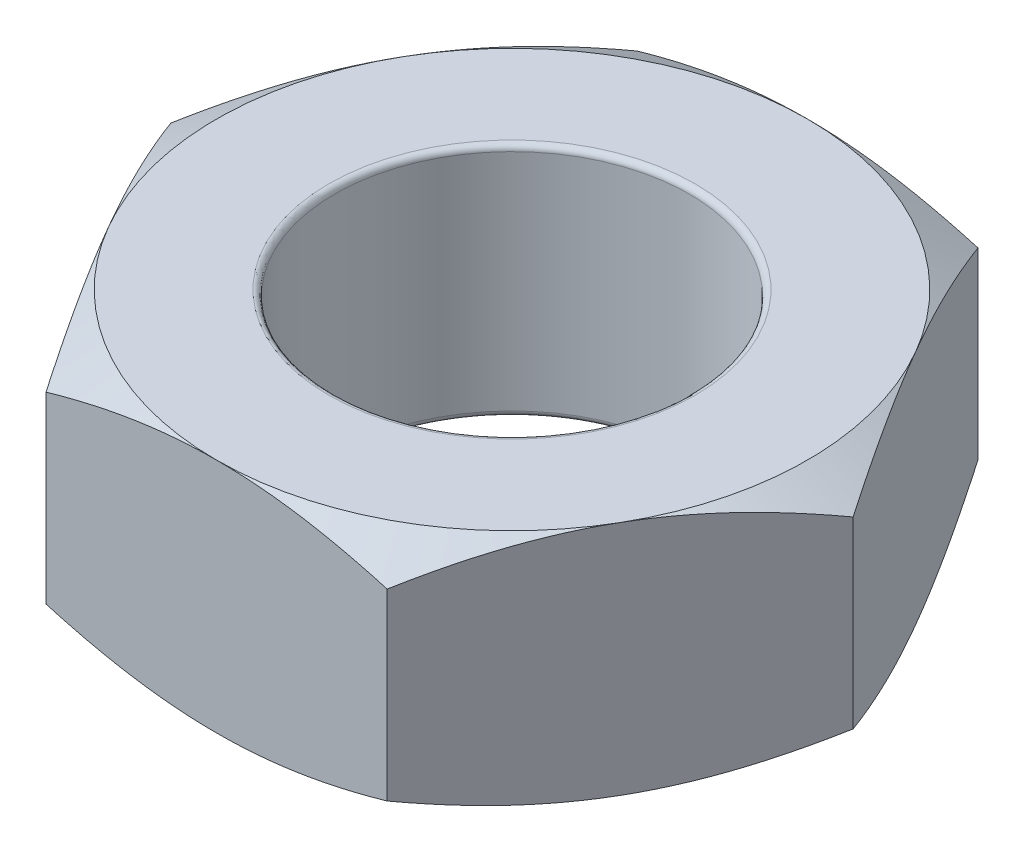
ISO-10303-21;
HEADER;
FILE_DESCRIPTION(('STEP AP214'),'2;1');
FILE_NAME('part.step','',(''),(''),'','','');
FILE_SCHEMA(('AUTOMOTIVE_DESIGN { 1 0 10303 214 1 1 1 1 }'));
ENDSEC;
DATA;
#1=APPLICATION_CONTEXT('core data for automotive mechanical design processes');
#2=APPLICATION_PROTOCOL_DEFINITION('international standard','automotive_design',2000,#1);
#3=PRODUCT_CONTEXT('',#1,'mechanical');
#4=PRODUCT('Part','Part','',(#3));
#5=PRODUCT_RELATED_PRODUCT_CATEGORY('part','',(#4));
#6=PRODUCT_DEFINITION_FORMATION('','',#4);
#7=PRODUCT_DEFINITION_CONTEXT('part definition',#1,'design');
#8=PRODUCT_DEFINITION('design','',#6,#7);
#9=PRODUCT_DEFINITION_SHAPE('','',#8);
#10=(LENGTH_UNIT() NAMED_UNIT(*) SI_UNIT(.MILLI.,.METRE.));
#11=(NAMED_UNIT(*) PLANE_ANGLE_UNIT() SI_UNIT($,.RADIAN.));
#12=(NAMED_UNIT(*) SI_UNIT($,.STERADIAN.) SOLID_ANGLE_UNIT());
#13=UNCERTAINTY_MEASURE_WITH_UNIT(LENGTH_MEASURE(1.E-05),#10,'distance_accuracy_value','');
#14=(GEOMETRIC_REPRESENTATION_CONTEXT(3) GLOBAL_UNCERTAINTY_ASSIGNED_CONTEXT((#13)) GLOBAL_UNIT_ASSIGNED_CONTEXT((#10,
#11,#12)) REPRESENTATION_CONTEXT('',''));
#15=CARTESIAN_POINT('',(0.,0.,0.));
#16=DIRECTION('',(0.,0.,1.));
#17=DIRECTION('',(1.,0.,0.));
#18=AXIS2_PLACEMENT_3D('',#15,#16,#17);
#19=CARTESIAN_POINT('',(-0.721687836487032,1.,-1.25));
#20=DIRECTION('',(0.866025403784439,0.,0.5));
#21=DIRECTION('',(0.5,0.,-0.866025403784439));
#22=AXIS2_PLACEMENT_3D('',#19,#20,#21);
#23=PLANE('',#22);
#24=CARTESIAN_POINT('',(-1.4434911430279,0.111712171512327,0.000200000000000438));
#25=CARTESIAN_POINT('',(-1.41177538446487,0.0933914116099904,-0.0547333052317648));
#26=CARTESIAN_POINT('',(-1.37978586023939,0.0767288030469375,-0.110140786500239));
#27=CARTESIAN_POINT('',(-1.31525277575269,0.0476428007920702,-0.221915367600339));
#28=CARTESIAN_POINT('',(-1.28270806805991,0.0352296988223504,-0.27828445484171));
#29=CARTESIAN_POINT('',(-1.21802202146378,0.0159051844823125,-0.390323974086984));
#30=CARTESIAN_POINT('',(-1.1858906404852,0.00886518629373267,-0.445977158459229));
#31=CARTESIAN_POINT('',(-1.12147653960455,0.0004579294769339,-0.557545653908391));
#32=CARTESIAN_POINT('',(-1.08919405413422,-0.000916287948974928,-0.6134605589376));
#33=CARTESIAN_POINT('',(-1.02886247391297,0.00192883421422075,-0.717957921181724));
#34=CARTESIAN_POINT('',(-1.00080438896118,0.00544959566631647,-0.766555949881315));
#35=CARTESIAN_POINT('',(-0.944871034195504,0.0166126095455567,-0.863435362173238));
#36=CARTESIAN_POINT('',(-0.91699595812502,0.0242586824189778,-0.911716410192163));
#37=CARTESIAN_POINT('',(-0.860947097873547,0.043374951546832,-1.00879588385404));
#38=CARTESIAN_POINT('',(-0.83278041460729,0.054926253825958,-1.0575820103519));
#39=CARTESIAN_POINT('',(-0.776867365453649,0.0811438115401921,-1.1544262522921));
#40=CARTESIAN_POINT('',(-0.74912028215514,0.0958038989854064,-1.20248561032696));
#41=CARTESIAN_POINT('',(-0.721572366433195,0.111712171512327,-1.2502));
#42=B_SPLINE_CURVE_WITH_KNOTS('',3,(#24,#25,#26,#27,#28,#29,#30,#31,#32,#33,#34,#35,#36,#37,#38,
#39,#40,#41),.UNSPECIFIED.,.F.,.F.,(4,2,2,2,2,2,2,2,4),(0.,0.198150821029559,0.396778196315221,
0.5904886173544,0.783961049317182,0.952480056398646,1.1211553973001,1.2935743034359,
1.4656542697693),.UNSPECIFIED.);
#43=CARTESIAN_POINT('',(-1.44337567297406,0.1116454968463,0.));
#44=VERTEX_POINT('',#43);
#45=CARTESIAN_POINT('',(-1.08253175473055,0.,-0.625));
#46=VERTEX_POINT('',#45);
#47=EDGE_CURVE('E374',#44,#46,#42,.T.);
#48=ORIENTED_EDGE('',*,*,#47,.F.);
#49=DIRECTION('',(0.,-1.,0.));
#50=VECTOR('',#49,1.);
#51=CARTESIAN_POINT('',(-1.44337567297406,1.,0.));
#52=LINE('',#51,#50);
#53=CARTESIAN_POINT('',(-1.44337567297406,0.8883545031537,0.));
#54=VERTEX_POINT('',#53);
#55=EDGE_CURVE('E318',#54,#44,#52,.T.);
#56=ORIENTED_EDGE('',*,*,#55,.F.);
#57=CARTESIAN_POINT('',(-0.721572366433195,0.888287828487673,-1.2502));
#58=CARTESIAN_POINT('',(-0.75328812499623,0.906608588390009,-1.19526669476823));
#59=CARTESIAN_POINT('',(-0.785277649221703,0.923271196953062,-1.13985921349976));
#60=CARTESIAN_POINT('',(-0.849810733708403,0.95235719920793,-1.02808463239966));
#61=CARTESIAN_POINT('',(-0.882355441401182,0.96477030117765,-0.97171554515829));
#62=CARTESIAN_POINT('',(-0.947041487997317,0.984094815517688,-0.859676025913016));
#63=CARTESIAN_POINT('',(-0.979172868975893,0.991134813706267,-0.804022841540771));
#64=CARTESIAN_POINT('',(-1.04358696985655,0.999542070523066,-0.692454346091609));
#65=CARTESIAN_POINT('',(-1.07586945532687,1.00091628794898,-0.6365394410624));
#66=CARTESIAN_POINT('',(-1.13620103554813,0.998071165785779,-0.532042078818275));
#67=CARTESIAN_POINT('',(-1.16425912049992,0.994550404333684,-0.483444050118685));
#68=CARTESIAN_POINT('',(-1.22019247526559,0.983387390454443,-0.386564637826762));
#69=CARTESIAN_POINT('',(-1.24806755133608,0.975741317581022,-0.338283589807837));
#70=CARTESIAN_POINT('',(-1.30411641158755,0.956625048453168,-0.241204116145957));
#71=CARTESIAN_POINT('',(-1.33228309485381,0.945073746174042,-0.192417989648101));
#72=CARTESIAN_POINT('',(-1.38819614400745,0.918856188459808,-0.0955737477078978));
#73=CARTESIAN_POINT('',(-1.41594322730596,0.904196101014594,-0.0475143896730355));
#74=CARTESIAN_POINT('',(-1.4434911430279,0.888287828487673,0.000200000000000359));
#75=B_SPLINE_CURVE_WITH_KNOTS('',3,(#57,#58,#59,#60,#61,#62,#63,#64,#65,#66,#67,#68,#69,#70,#71,
#72,#73,#74),.UNSPECIFIED.,.F.,.F.,(4,2,2,2,2,2,2,2,4),(0.,0.198150821029559,0.396778196315221,
0.590488617354399,0.783961049317181,0.952480056398646,1.1211553973001,1.2935743034359,
1.4656542697693),.UNSPECIFIED.);
#76=CARTESIAN_POINT('',(-1.08253175473055,1.,-0.625));
#77=VERTEX_POINT('',#76);
#78=EDGE_CURVE('E257',#77,#54,#75,.T.);
#79=ORIENTED_EDGE('',*,*,#78,.F.);
#80=CARTESIAN_POINT('',(-0.721687836487037,0.888354503153702,-1.25));
#81=VERTEX_POINT('',#80);
#82=EDGE_CURVE('E331',#81,#77,#75,.T.);
#83=ORIENTED_EDGE('',*,*,#82,.F.);
#84=DIRECTION('',(0.,-1.,0.));
#85=VECTOR('',#84,1.);
#86=CARTESIAN_POINT('',(-0.721687836487032,1.,-1.25));
#87=LINE('',#86,#85);
#88=CARTESIAN_POINT('',(-0.721687836487032,0.111645496846301,-1.25));
#89=VERTEX_POINT('',#88);
#90=EDGE_CURVE('E329',#81,#89,#87,.T.);
#91=ORIENTED_EDGE('',*,*,#90,.T.);
#92=EDGE_CURVE('E211',#46,#89,#42,.T.);
#93=ORIENTED_EDGE('',*,*,#92,.F.);
#94=EDGE_LOOP('',(#48,#56,#79,#83,#91,#93));
#95=FACE_BOUND('',#94,.T.);
#96=ADVANCED_FACE('F37',(#95),#23,.F.);
#97=CARTESIAN_POINT('',(-1.44337567297406,1.,0.));
#98=DIRECTION('',(0.866025403784439,0.,-0.5));
#99=DIRECTION('',(-0.5,0.,-0.866025403784439));
#100=AXIS2_PLACEMENT_3D('',#97,#98,#99);
#101=PLANE('',#100);
#102=CARTESIAN_POINT('',(-0.721572366433195,0.111712171512327,1.2502));
#103=CARTESIAN_POINT('',(-0.75328812499623,0.0933914116099906,1.19526669476823));
#104=CARTESIAN_POINT('',(-0.785277649221703,0.0767288030469376,1.13985921349976));
#105=CARTESIAN_POINT('',(-0.849810733708404,0.0476428007920703,1.02808463239966));
#106=CARTESIAN_POINT('',(-0.882355441401182,0.0352296988223505,0.97171554515829));
#107=CARTESIAN_POINT('',(-0.947041487997317,0.0159051844823125,0.859676025913016));
#108=CARTESIAN_POINT('',(-0.979172868975893,0.00886518629373278,0.804022841540771));
#109=CARTESIAN_POINT('',(-1.04358696985655,0.000457929476934025,0.692454346091609));
#110=CARTESIAN_POINT('',(-1.07586945532687,-0.00091628794897485,0.6365394410624));
#111=CARTESIAN_POINT('',(-1.13620103554813,0.0019288342142208,0.532042078818275));
#112=CARTESIAN_POINT('',(-1.16425912049992,0.00544959566631651,0.483444050118685));
#113=CARTESIAN_POINT('',(-1.22019247526559,0.0166126095455567,0.386564637826762));
#114=CARTESIAN_POINT('',(-1.24806755133608,0.0242586824189779,0.338283589807837));
#115=CARTESIAN_POINT('',(-1.30411641158755,0.0433749515468321,0.241204116145957));
#116=CARTESIAN_POINT('',(-1.33228309485381,0.0549262538259581,0.192417989648101));
#117=CARTESIAN_POINT('',(-1.38819614400745,0.0811438115401922,0.0955737477078984));
#118=CARTESIAN_POINT('',(-1.41594322730596,0.0958038989854065,0.0475143896730362));
#119=CARTESIAN_POINT('',(-1.4434911430279,0.111712171512327,-0.000199999999999591));
#120=B_SPLINE_CURVE_WITH_KNOTS('',3,(#102,#103,#104,#105,#106,#107,#108,#109,#110,#111,#112,
#113,#114,#115,#116,#117,#118,#119),.UNSPECIFIED.,.F.,.F.,(4,2,2,2,2,2,2,2,4),(0.,
0.198150821029559,0.396778196315221,0.590488617354399,0.783961049317182,0.952480056398646,
1.1211553973001,1.2935743034359,1.4656542697693),.UNSPECIFIED.);
#121=CARTESIAN_POINT('',(-0.721687836487032,0.111645496846301,1.25));
#122=VERTEX_POINT('',#121);
#123=CARTESIAN_POINT('',(-1.08253175473055,0.,0.625));
#124=VERTEX_POINT('',#123);
#125=EDGE_CURVE('E147',#122,#124,#120,.T.);
#126=ORIENTED_EDGE('',*,*,#125,.F.);
#127=DIRECTION('',(0.,-1.,0.));
#128=VECTOR('',#127,1.);
#129=CARTESIAN_POINT('',(-0.721687836487032,1.,1.25));
#130=LINE('',#129,#128);
#131=CARTESIAN_POINT('',(-0.721687836487032,0.8883545031537,1.25));
#132=VERTEX_POINT('',#131);
#133=EDGE_CURVE('E162',#132,#122,#130,.T.);
#134=ORIENTED_EDGE('',*,*,#133,.F.);
#135=CARTESIAN_POINT('',(-1.4434911430279,0.888287828487673,-0.000199999999999532));
#136=CARTESIAN_POINT('',(-1.41177538446487,0.906608588390009,0.0547333052317657));
#137=CARTESIAN_POINT('',(-1.37978586023939,0.923271196953062,0.11014078650024));
#138=CARTESIAN_POINT('',(-1.31525277575269,0.95235719920793,0.22191536760034));
#139=CARTESIAN_POINT('',(-1.28270806805991,0.96477030117765,0.278284454841711));
#140=CARTESIAN_POINT('',(-1.21802202146378,0.984094815517688,0.390323974086985));
#141=CARTESIAN_POINT('',(-1.1858906404852,0.991134813706267,0.44597715845923));
#142=CARTESIAN_POINT('',(-1.12147653960455,0.999542070523066,0.557545653908392));
#143=CARTESIAN_POINT('',(-1.08919405413422,1.00091628794897,0.6134605589376));
#144=CARTESIAN_POINT('',(-1.02886247391297,0.998071165785779,0.717957921181725));
#145=CARTESIAN_POINT('',(-1.00080438896118,0.994550404333684,0.766555949881316));
#146=CARTESIAN_POINT('',(-0.944871034195504,0.983387390454443,0.863435362173238));
#147=CARTESIAN_POINT('',(-0.91699595812502,0.975741317581022,0.911716410192163));
#148=CARTESIAN_POINT('',(-0.860947097873547,0.956625048453168,1.00879588385404));
#149=CARTESIAN_POINT('',(-0.83278041460729,0.945073746174042,1.0575820103519));
#150=CARTESIAN_POINT('',(-0.776867365453649,0.918856188459808,1.1544262522921));
#151=CARTESIAN_POINT('',(-0.749120282155141,0.904196101014593,1.20248561032696));
#152=CARTESIAN_POINT('',(-0.721572366433195,0.888287828487673,1.2502));
#153=B_SPLINE_CURVE_WITH_KNOTS('',3,(#135,#136,#137,#138,#139,#140,#141,#142,#143,#144,#145,
#146,#147,#148,#149,#150,#151,#152),.UNSPECIFIED.,.F.,.F.,(4,2,2,2,2,2,2,2,4),(0.,
0.19815082102956,0.396778196315221,0.590488617354399,0.783961049317181,0.952480056398645,
1.1211553973001,1.2935743034359,1.4656542697693),.UNSPECIFIED.);
#154=CARTESIAN_POINT('',(-1.08253175473055,1.,0.625));
#155=VERTEX_POINT('',#154);
#156=EDGE_CURVE('E250',#155,#132,#153,.T.);
#157=ORIENTED_EDGE('',*,*,#156,.F.);
#158=EDGE_CURVE('E256',#54,#155,#153,.T.);
#159=ORIENTED_EDGE('',*,*,#158,.F.);
#160=ORIENTED_EDGE('',*,*,#55,.T.);
#161=EDGE_CURVE('E172',#124,#44,#120,.T.);
#162=ORIENTED_EDGE('',*,*,#161,.F.);
#163=EDGE_LOOP('',(#126,#134,#157,#159,#160,#162));
#164=FACE_BOUND('',#163,.T.);
#165=ADVANCED_FACE('F263',(#164),#101,.F.);
#166=CARTESIAN_POINT('',(-0.721687836487032,1.,1.25));
#167=DIRECTION('',(0.,0.,-1.));
#168=DIRECTION('',(-1.,0.,0.));
#169=AXIS2_PLACEMENT_3D('',#166,#167,#168);
#170=PLANE('',#169);
#171=CARTESIAN_POINT('',(2.4716015347714,0.877407131162305,1.25));
#172=CARTESIAN_POINT('',(2.41405977422583,0.847763895763395,1.25));
#173=CARTESIAN_POINT('',(2.35643414974349,0.818282516658582,1.25));
#174=CARTESIAN_POINT('',(2.24097808995528,0.759721147765188,1.25));
#175=CARTESIAN_POINT('',(2.18314765091293,0.730641165347252,1.25));
#176=CARTESIAN_POINT('',(2.0091096066032,0.644028369071911,1.25));
#177=CARTESIAN_POINT('',(1.89254077315828,0.587218895843059,1.25));
#178=CARTESIAN_POINT('',(1.65182615880907,0.473569858646931,1.25));
#179=CARTESIAN_POINT('',(1.52760519049406,0.416886955648541,1.25));
#180=CARTESIAN_POINT('',(1.33957833657882,0.335865911391751,1.25));
#181=CARTESIAN_POINT('',(1.27663578120437,0.309532077294552,1.25));
#182=CARTESIAN_POINT('',(1.15004593447583,0.25862434827563,1.25));
#183=CARTESIAN_POINT('',(1.08639871237996,0.234050282137182,1.25));
#184=CARTESIAN_POINT('',(0.948057950230362,0.183483361606821,1.25));
#185=CARTESIAN_POINT('',(0.87321758144964,0.157886504051104,1.25));
#186=CARTESIAN_POINT('',(0.722217286580671,0.110989012999937,1.25));
#187=CARTESIAN_POINT('',(0.646058046068412,0.0896862160921308,1.25));
#188=CARTESIAN_POINT('',(0.493783871042498,0.0532585198602233,1.25));
#189=CARTESIAN_POINT('',(0.417696228099557,0.0380227335506863,1.25));
#190=CARTESIAN_POINT('',(0.264431617717022,0.0147408886612164,1.25));
#191=CARTESIAN_POINT('',(0.187255318283788,0.00669060063045931,1.25));
#192=CARTESIAN_POINT('',(0.0314012780483082,-0.00118049550980133,1.25));
#193=CARTESIAN_POINT('',(-0.0472825385899157,-0.000886929228845556,1.25));
#194=CARTESIAN_POINT('',(-0.204163396240214,0.00816915829558759,1.25));
#195=CARTESIAN_POINT('',(-0.282360265198839,0.016934519012739,1.25));
#196=CARTESIAN_POINT('',(-0.439129489054033,0.041970770364224,1.25));
#197=CARTESIAN_POINT('',(-0.517677083770491,0.0583908150314983,1.25));
#198=CARTESIAN_POINT('',(-0.673315045227511,0.0970312104550352,1.25));
#199=CARTESIAN_POINT('',(-0.750404938794047,0.119253411087208,1.25));
#200=CARTESIAN_POINT('',(-0.900485197445787,0.167056152765159,1.25));
#201=CARTESIAN_POINT('',(-0.97352368878239,0.192488561471524,1.25));
#202=CARTESIAN_POINT('',(-1.11854568446025,0.246222750977816,1.25));
#203=CARTESIAN_POINT('',(-1.19052892224579,0.274525242935103,1.25));
#204=CARTESIAN_POINT('',(-1.33370308914737,0.333257070047254,1.25));
#205=CARTESIAN_POINT('',(-1.40489311223841,0.363688595650743,1.25));
#206=CARTESIAN_POINT('',(-1.54658657054083,0.426112266998933,1.25));
#207=CARTESIAN_POINT('',(-1.61708996754361,0.458104499003528,1.25));
#208=CARTESIAN_POINT('',(-1.7535374422815,0.521405377081556,1.25));
#209=CARTESIAN_POINT('',(-1.8195119434709,0.552648710962086,1.25));
#210=CARTESIAN_POINT('',(-1.95106920419111,0.615953295338603,1.25));
#211=CARTESIAN_POINT('',(-2.01665195063143,0.648014572979572,1.25));
#212=CARTESIAN_POINT('',(-2.14728006638468,0.712674057279735,1.25));
#213=CARTESIAN_POINT('',(-2.21232649745615,0.745270123912039,1.25));
#214=CARTESIAN_POINT('',(-2.34215055827398,0.810979804626186,1.25));
#215=CARTESIAN_POINT('',(-2.40692821075694,0.844093373753204,1.25));
#216=CARTESIAN_POINT('',(-2.4716015347714,0.877407131162305,1.25));
#217=B_SPLINE_CURVE_WITH_KNOTS('',3,(#171,#172,#173,#174,#175,#176,#177,#178,#179,#180,#181,
#182,#183,#184,#185,#186,#187,#188,#189,#190,#191,#192,#193,#194,#195,#196,#197,#198,#199,#200,
#201,#202,#203,#204,#205,#206,#207,#208,#209,#210,#211,#212,#213,#214,#215,#216),.UNSPECIFIED.,
.F.,.F.,(4,2,2,2,2,2,2,2,2,2,2,2,2,2,2,2,2,2,2,2,2,2,4),(0.,0.194185712361144,0.388374985726421,
0.77738032353389,1.18691693245395,1.39158496709435,1.59623306141471,1.83343067031534,
2.07050847514682,2.30302888249811,2.53541233575724,2.77098273019569,3.00663210766222,
3.24707848054461,3.48760160769763,3.71954206672612,3.95154013770054,4.18378051252462,
4.41603373779705,4.63502239860406,4.85401833643477,5.07228603090095,5.29053486895851),.UNSPECIFIED.);
#218=CARTESIAN_POINT('',(0.721687836487032,0.111645496846301,1.25));
#219=VERTEX_POINT('',#218);
#220=CARTESIAN_POINT('',(0.,0.,1.25));
#221=VERTEX_POINT('',#220);
#222=EDGE_CURVE('E126',#219,#221,#217,.T.);
#223=ORIENTED_EDGE('',*,*,#222,.F.);
#224=DIRECTION('',(0.,-1.,0.));
#225=VECTOR('',#224,1.);
#226=CARTESIAN_POINT('',(0.721687836487032,1.,1.25));
#227=LINE('',#226,#225);
#228=CARTESIAN_POINT('',(0.721687836487032,0.8883545031537,1.25));
#229=VERTEX_POINT('',#228);
#230=EDGE_CURVE('E322',#229,#219,#227,.T.);
#231=ORIENTED_EDGE('',*,*,#230,.F.);
#232=CARTESIAN_POINT('',(-2.4716015347714,0.122592868837695,1.25));
#233=CARTESIAN_POINT('',(-2.41405977422583,0.152236104236605,1.25));
#234=CARTESIAN_POINT('',(-2.35643414974349,0.181717483341417,1.25));
#235=CARTESIAN_POINT('',(-2.24097808995528,0.240278852234812,1.25));
#236=CARTESIAN_POINT('',(-2.18314765091293,0.269358834652748,1.25));
#237=CARTESIAN_POINT('',(-2.0091096066032,0.355971630928089,1.25));
#238=CARTESIAN_POINT('',(-1.89254077315829,0.412781104156941,1.25));
#239=CARTESIAN_POINT('',(-1.65182615880907,0.526430141353069,1.25));
#240=CARTESIAN_POINT('',(-1.52760519049407,0.583113044351459,1.25));
#241=CARTESIAN_POINT('',(-1.33957833657883,0.664134088608249,1.25));
#242=CARTESIAN_POINT('',(-1.27663578120437,0.690467922705448,1.25));
#243=CARTESIAN_POINT('',(-1.15004593447584,0.74137565172437,1.25));
#244=CARTESIAN_POINT('',(-1.08639871237996,0.765949717862818,1.25));
#245=CARTESIAN_POINT('',(-0.948057950230362,0.816516638393179,1.25));
#246=CARTESIAN_POINT('',(-0.87321758144964,0.842113495948897,1.25));
#247=CARTESIAN_POINT('',(-0.722217286580671,0.889010987000063,1.25));
#248=CARTESIAN_POINT('',(-0.646058046068412,0.910313783907869,1.25));
#249=CARTESIAN_POINT('',(-0.493783871042497,0.946741480139777,1.25));
#250=CARTESIAN_POINT('',(-0.417696228099557,0.961977266449314,1.25));
#251=CARTESIAN_POINT('',(-0.264431617717022,0.985259111338784,1.25));
#252=CARTESIAN_POINT('',(-0.187255318283788,0.993309399369541,1.25));
#253=CARTESIAN_POINT('',(-0.0314012780483083,1.0011804955098,1.25));
#254=CARTESIAN_POINT('',(0.0472825385899154,1.00088692922885,1.25));
#255=CARTESIAN_POINT('',(0.204163396240214,0.991830841704412,1.25));
#256=CARTESIAN_POINT('',(0.282360265198839,0.983065480987261,1.25));
#257=CARTESIAN_POINT('',(0.439129489054033,0.958029229635776,1.25));
#258=CARTESIAN_POINT('',(0.517677083770491,0.941609184968502,1.25));
#259=CARTESIAN_POINT('',(0.673315045227512,0.902968789544965,1.25));
#260=CARTESIAN_POINT('',(0.750404938794047,0.880746588912792,1.25));
#261=CARTESIAN_POINT('',(0.900485197445787,0.832943847234841,1.25));
#262=CARTESIAN_POINT('',(0.97352368878239,0.807511438528476,1.25));
#263=CARTESIAN_POINT('',(1.11854568446025,0.753777249022184,1.25));
#264=CARTESIAN_POINT('',(1.19052892224579,0.725474757064897,1.25));
#265=CARTESIAN_POINT('',(1.33370308914737,0.666742929952746,1.25));
#266=CARTESIAN_POINT('',(1.40489311223841,0.636311404349257,1.25));
#267=CARTESIAN_POINT('',(1.54658657054083,0.573887733001068,1.25));
#268=CARTESIAN_POINT('',(1.61708996754361,0.541895500996472,1.25));
#269=CARTESIAN_POINT('',(1.7535374422815,0.478594622918445,1.25));
#270=CARTESIAN_POINT('',(1.8195119434709,0.447351289037914,1.25));
#271=CARTESIAN_POINT('',(1.95106920419111,0.384046704661397,1.25));
#272=CARTESIAN_POINT('',(2.01665195063143,0.351985427020427,1.25));
#273=CARTESIAN_POINT('',(2.14728006638468,0.287325942720264,1.25));
#274=CARTESIAN_POINT('',(2.21232649745615,0.254729876087961,1.25));
#275=CARTESIAN_POINT('',(2.34215055827398,0.189020195373814,1.25));
#276=CARTESIAN_POINT('',(2.40692821075694,0.155906626246796,1.25));
#277=CARTESIAN_POINT('',(2.4716015347714,0.122592868837695,1.25));
#278=B_SPLINE_CURVE_WITH_KNOTS('',3,(#232,#233,#234,#235,#236,#237,#238,#239,#240,#241,#242,
#243,#244,#245,#246,#247,#248,#249,#250,#251,#252,#253,#254,#255,#256,#257,#258,#259,#260,#261,
#262,#263,#264,#265,#266,#267,#268,#269,#270,#271,#272,#273,#274,#275,#276,#277),.UNSPECIFIED.,
.F.,.F.,(4,2,2,2,2,2,2,2,2,2,2,2,2,2,2,2,2,2,2,2,2,2,4),(0.,0.194185712361144,0.388374985726421,
0.777380323533889,1.18691693245395,1.39158496709435,1.59623306141471,1.83343067031534,
2.07050847514682,2.30302888249811,2.53541233575724,2.7709827301957,3.00663210766222,
3.24707848054461,3.48760160769763,3.71954206672612,3.95154013770054,4.18378051252461,
4.41603373779705,4.63502239860406,4.85401833643477,5.07228603090095,5.29053486895851),.UNSPECIFIED.);
#279=CARTESIAN_POINT('',(0.,1.,1.25));
#280=VERTEX_POINT('',#279);
#281=EDGE_CURVE('E243',#280,#229,#278,.T.);
#282=ORIENTED_EDGE('',*,*,#281,.F.);
#283=EDGE_CURVE('E249',#132,#280,#278,.T.);
#284=ORIENTED_EDGE('',*,*,#283,.F.);
#285=ORIENTED_EDGE('',*,*,#133,.T.);
#286=EDGE_CURVE('E139',#221,#122,#217,.T.);
#287=ORIENTED_EDGE('',*,*,#286,.F.);
#288=EDGE_LOOP('',(#223,#231,#282,#284,#285,#287));
#289=FACE_BOUND('',#288,.T.);
#290=ADVANCED_FACE('F159',(#289),#170,.F.);
#291=CARTESIAN_POINT('',(0.721687836487032,1.,1.25));
#292=DIRECTION('',(-0.866025403784439,0.,-0.5));
#293=DIRECTION('',(-0.5,0.,0.866025403784439));
#294=AXIS2_PLACEMENT_3D('',#291,#292,#293);
#295=PLANE('',#294);
#296=CARTESIAN_POINT('',(1.4434911430279,0.111712171512327,-0.000200000000000435));
#297=CARTESIAN_POINT('',(1.41177538446487,0.0933914116099902,0.0547333052317649));
#298=CARTESIAN_POINT('',(1.37978586023939,0.0767288030469372,0.110140786500239));
#299=CARTESIAN_POINT('',(1.31525277575269,0.0476428007920699,0.22191536760034));
#300=CARTESIAN_POINT('',(1.28270806805991,0.0352296988223501,0.27828445484171));
#301=CARTESIAN_POINT('',(1.21802202146378,0.0159051844823122,0.390323974086984));
#302=CARTESIAN_POINT('',(1.1858906404852,0.00886518629373252,0.445977158459229));
#303=CARTESIAN_POINT('',(1.12147653960455,0.000457929476933796,0.557545653908391));
#304=CARTESIAN_POINT('',(1.08919405413422,-0.000916287948975102,0.6134605589376));
#305=CARTESIAN_POINT('',(1.02886247391297,0.0019288342142205,0.717957921181724));
#306=CARTESIAN_POINT('',(1.00080438896118,0.0054495956663162,0.766555949881315));
#307=CARTESIAN_POINT('',(0.944871034195503,0.0166126095455564,0.863435362173238));
#308=CARTESIAN_POINT('',(0.91699595812502,0.0242586824189776,0.911716410192163));
#309=CARTESIAN_POINT('',(0.860947097873546,0.0433749515468319,1.00879588385404));
#310=CARTESIAN_POINT('',(0.83278041460729,0.0549262538259579,1.0575820103519));
#311=CARTESIAN_POINT('',(0.776867365453649,0.0811438115401921,1.1544262522921));
#312=CARTESIAN_POINT('',(0.74912028215514,0.0958038989854064,1.20248561032696));
#313=CARTESIAN_POINT('',(0.721572366433194,0.111712171512327,1.2502));
#314=B_SPLINE_CURVE_WITH_KNOTS('',3,(#296,#297,#298,#299,#300,#301,#302,#303,#304,#305,#306,
#307,#308,#309,#310,#311,#312,#313),.UNSPECIFIED.,.F.,.F.,(4,2,2,2,2,2,2,2,4),(0.,
0.198150821029559,0.396778196315221,0.590488617354399,0.783961049317181,0.952480056398646,
1.1211553973001,1.2935743034359,1.4656542697693),.UNSPECIFIED.);
#315=CARTESIAN_POINT('',(1.44337567297406,0.1116454968463,0.));
#316=VERTEX_POINT('',#315);
#317=CARTESIAN_POINT('',(1.08253175473055,0.,0.624999999999999));
#318=VERTEX_POINT('',#317);
#319=EDGE_CURVE('E52',#316,#318,#314,.T.);
#320=ORIENTED_EDGE('',*,*,#319,.F.);
#321=DIRECTION('',(0.,-1.,0.));
#322=VECTOR('',#321,1.);
#323=CARTESIAN_POINT('',(1.44337567297406,1.,0.));
#324=LINE('',#323,#322);
#325=CARTESIAN_POINT('',(1.44337567297406,0.8883545031537,0.));
#326=VERTEX_POINT('',#325);
#327=EDGE_CURVE('E324',#326,#316,#324,.T.);
#328=ORIENTED_EDGE('',*,*,#327,.F.);
#329=CARTESIAN_POINT('',(0.721572366433194,0.888287828487673,1.2502));
#330=CARTESIAN_POINT('',(0.75328812499623,0.90660858839001,1.19526669476824));
#331=CARTESIAN_POINT('',(0.785277649221703,0.923271196953062,1.13985921349976));
#332=CARTESIAN_POINT('',(0.849810733708403,0.95235719920793,1.02808463239966));
#333=CARTESIAN_POINT('',(0.882355441401182,0.96477030117765,0.97171554515829));
#334=CARTESIAN_POINT('',(0.947041487997317,0.984094815517688,0.859676025913016));
#335=CARTESIAN_POINT('',(0.979172868975893,0.991134813706267,0.804022841540771));
#336=CARTESIAN_POINT('',(1.04358696985655,0.999542070523066,0.692454346091609));
#337=CARTESIAN_POINT('',(1.07586945532687,1.00091628794898,0.6365394410624));
#338=CARTESIAN_POINT('',(1.13620103554812,0.99807116578578,0.532042078818275));
#339=CARTESIAN_POINT('',(1.16425912049992,0.994550404333684,0.483444050118685));
#340=CARTESIAN_POINT('',(1.22019247526559,0.983387390454444,0.386564637826762));
#341=CARTESIAN_POINT('',(1.24806755133608,0.975741317581023,0.338283589807837));
#342=CARTESIAN_POINT('',(1.30411641158755,0.956625048453168,0.241204116145957));
#343=CARTESIAN_POINT('',(1.33228309485381,0.945073746174042,0.1924179896481));
#344=CARTESIAN_POINT('',(1.38819614400745,0.918856188459808,0.0955737477078975));
#345=CARTESIAN_POINT('',(1.41594322730596,0.904196101014594,0.0475143896730354));
#346=CARTESIAN_POINT('',(1.4434911430279,0.888287828487673,-0.000200000000000425));
#347=B_SPLINE_CURVE_WITH_KNOTS('',3,(#329,#330,#331,#332,#333,#334,#335,#336,#337,#338,#339,
#340,#341,#342,#343,#344,#345,#346),.UNSPECIFIED.,.F.,.F.,(4,2,2,2,2,2,2,2,4),(0.,
0.198150821029559,0.396778196315221,0.590488617354399,0.783961049317182,0.952480056398646,
1.1211553973001,1.2935743034359,1.4656542697693),.UNSPECIFIED.);
#348=CARTESIAN_POINT('',(1.08253175473055,1.,0.624999999999999));
#349=VERTEX_POINT('',#348);
#350=EDGE_CURVE('E230',#349,#326,#347,.T.);
#351=ORIENTED_EDGE('',*,*,#350,.F.);
#352=EDGE_CURVE('E236',#229,#349,#347,.T.);
#353=ORIENTED_EDGE('',*,*,#352,.F.);
#354=ORIENTED_EDGE('',*,*,#230,.T.);
#355=EDGE_CURVE('E133',#318,#219,#314,.T.);
#356=ORIENTED_EDGE('',*,*,#355,.F.);
#357=EDGE_LOOP('',(#320,#328,#351,#353,#354,#356));
#358=FACE_BOUND('',#357,.T.);
#359=ADVANCED_FACE('F222',(#358),#295,.F.);
#360=CARTESIAN_POINT('',(1.44337567297406,1.,0.));
#361=DIRECTION('',(-0.866025403784439,0.,0.5));
#362=DIRECTION('',(0.5,0.,0.866025403784439));
#363=AXIS2_PLACEMENT_3D('',#360,#361,#362);
#364=PLANE('',#363);
#365=CARTESIAN_POINT('',(0.721572366433194,0.111712171512327,-1.2502));
#366=CARTESIAN_POINT('',(0.753288124996229,0.0933914116099903,-1.19526669476824));
#367=CARTESIAN_POINT('',(0.785277649221702,0.0767288030469373,-1.13985921349976));
#368=CARTESIAN_POINT('',(0.849810733708403,0.0476428007920701,-1.02808463239966));
#369=CARTESIAN_POINT('',(0.882355441401181,0.0352296988223503,-0.97171554515829));
#370=CARTESIAN_POINT('',(0.947041487997316,0.0159051844823123,-0.859676025913016));
#371=CARTESIAN_POINT('',(0.979172868975892,0.00886518629373247,-0.804022841540771));
#372=CARTESIAN_POINT('',(1.04358696985655,0.000457929476933663,-0.692454346091609));
#373=CARTESIAN_POINT('',(1.07586945532687,-0.000916287948975175,-0.6365394410624));
#374=CARTESIAN_POINT('',(1.13620103554812,0.00192883421422044,-0.532042078818276));
#375=CARTESIAN_POINT('',(1.16425912049992,0.00544959566631611,-0.483444050118685));
#376=CARTESIAN_POINT('',(1.22019247526559,0.0166126095455563,-0.386564637826762));
#377=CARTESIAN_POINT('',(1.24806755133608,0.0242586824189774,-0.338283589807837));
#378=CARTESIAN_POINT('',(1.30411641158755,0.0433749515468317,-0.241204116145958));
#379=CARTESIAN_POINT('',(1.33228309485381,0.0549262538259577,-0.192417989648101));
#380=CARTESIAN_POINT('',(1.38819614400745,0.0811438115401918,-0.0955737477078984));
#381=CARTESIAN_POINT('',(1.41594322730596,0.0958038989854062,-0.0475143896730362));
#382=CARTESIAN_POINT('',(1.4434911430279,0.111712171512327,0.000199999999999561));
#383=B_SPLINE_CURVE_WITH_KNOTS('',3,(#365,#366,#367,#368,#369,#370,#371,#372,#373,#374,#375,
#376,#377,#378,#379,#380,#381,#382),.UNSPECIFIED.,.F.,.F.,(4,2,2,2,2,2,2,2,4),(0.,
0.19815082102956,0.39677819631522,0.590488617354399,0.783961049317181,0.952480056398646,
1.1211553973001,1.2935743034359,1.4656542697693),.UNSPECIFIED.);
#384=CARTESIAN_POINT('',(0.721687836487036,0.111645496846298,-1.25));
#385=VERTEX_POINT('',#384);
#386=CARTESIAN_POINT('',(1.08253175473055,0.,-0.625));
#387=VERTEX_POINT('',#386);
#388=EDGE_CURVE('E60',#385,#387,#383,.T.);
#389=ORIENTED_EDGE('',*,*,#388,.F.);
#390=DIRECTION('',(0.,-1.,0.));
#391=VECTOR('',#390,1.);
#392=CARTESIAN_POINT('',(0.721687836487032,1.,-1.25));
#393=LINE('',#392,#391);
#394=CARTESIAN_POINT('',(0.721687836487032,0.8883545031537,-1.25));
#395=VERTEX_POINT('',#394);
#396=EDGE_CURVE('E327',#395,#385,#393,.T.);
#397=ORIENTED_EDGE('',*,*,#396,.F.);
#398=CARTESIAN_POINT('',(1.4434911430279,0.888287828487673,0.00019999999999952));
#399=CARTESIAN_POINT('',(1.41177538446487,0.90660858839001,-0.0547333052317655));
#400=CARTESIAN_POINT('',(1.37978586023939,0.923271196953063,-0.11014078650024));
#401=CARTESIAN_POINT('',(1.31525277575269,0.95235719920793,-0.22191536760034));
#402=CARTESIAN_POINT('',(1.28270806805991,0.96477030117765,-0.278284454841711));
#403=CARTESIAN_POINT('',(1.21802202146378,0.984094815517688,-0.390323974086985));
#404=CARTESIAN_POINT('',(1.1858906404852,0.991134813706268,-0.44597715845923));
#405=CARTESIAN_POINT('',(1.12147653960455,0.999542070523066,-0.557545653908391));
#406=CARTESIAN_POINT('',(1.08919405413422,1.00091628794898,-0.6134605589376));
#407=CARTESIAN_POINT('',(1.02886247391297,0.998071165785779,-0.717957921181725));
#408=CARTESIAN_POINT('',(1.00080438896118,0.994550404333684,-0.766555949881315));
#409=CARTESIAN_POINT('',(0.944871034195503,0.983387390454444,-0.863435362173238));
#410=CARTESIAN_POINT('',(0.916995958125019,0.975741317581022,-0.911716410192163));
#411=CARTESIAN_POINT('',(0.860947097873546,0.956625048453168,-1.00879588385404));
#412=CARTESIAN_POINT('',(0.832780414607289,0.945073746174042,-1.0575820103519));
#413=CARTESIAN_POINT('',(0.776867365453648,0.918856188459808,-1.1544262522921));
#414=CARTESIAN_POINT('',(0.74912028215514,0.904196101014594,-1.20248561032696));
#415=CARTESIAN_POINT('',(0.721572366433194,0.888287828487673,-1.2502));
#416=B_SPLINE_CURVE_WITH_KNOTS('',3,(#398,#399,#400,#401,#402,#403,#404,#405,#406,#407,#408,
#409,#410,#411,#412,#413,#414,#415),.UNSPECIFIED.,.F.,.F.,(4,2,2,2,2,2,2,2,4),(0.,
0.198150821029559,0.39677819631522,0.590488617354399,0.783961049317181,0.952480056398645,
1.1211553973001,1.2935743034359,1.4656542697693),.UNSPECIFIED.);
#417=CARTESIAN_POINT('',(1.08253175473055,1.,-0.625));
#418=VERTEX_POINT('',#417);
#419=EDGE_CURVE('E238',#418,#395,#416,.T.);
#420=ORIENTED_EDGE('',*,*,#419,.F.);
#421=EDGE_CURVE('E237',#326,#418,#416,.T.);
#422=ORIENTED_EDGE('',*,*,#421,.F.);
#423=ORIENTED_EDGE('',*,*,#327,.T.);
#424=EDGE_CURVE('E221',#387,#316,#383,.T.);
#425=ORIENTED_EDGE('',*,*,#424,.F.);
#426=EDGE_LOOP('',(#389,#397,#420,#422,#423,#425));
#427=FACE_BOUND('',#426,.T.);
#428=ADVANCED_FACE('F225',(#427),#364,.F.);
#429=CARTESIAN_POINT('',(0.721687836487032,1.,-1.25));
#430=DIRECTION('',(0.,0.,1.));
#431=DIRECTION('',(1.,0.,0.));
#432=AXIS2_PLACEMENT_3D('',#429,#430,#431);
#433=PLANE('',#432);
#434=CARTESIAN_POINT('',(-2.4716015347714,0.877407131162305,-1.25));
#435=CARTESIAN_POINT('',(-2.41405977422583,0.847763895763395,-1.25));
#436=CARTESIAN_POINT('',(-2.35643414974349,0.818282516658582,-1.25));
#437=CARTESIAN_POINT('',(-2.24097808995528,0.759721147765188,-1.25));
#438=CARTESIAN_POINT('',(-2.18314765091293,0.730641165347252,-1.25));
#439=CARTESIAN_POINT('',(-2.0091096066032,0.644028369071911,-1.25));
#440=CARTESIAN_POINT('',(-1.89254077315828,0.587218895843059,-1.25));
#441=CARTESIAN_POINT('',(-1.65182615880907,0.473569858646931,-1.25));
#442=CARTESIAN_POINT('',(-1.52760519049406,0.416886955648541,-1.25));
#443=CARTESIAN_POINT('',(-1.33957833657882,0.335865911391751,-1.25));
#444=CARTESIAN_POINT('',(-1.27663578120437,0.309532077294552,-1.25));
#445=CARTESIAN_POINT('',(-1.15004593447583,0.25862434827563,-1.25));
#446=CARTESIAN_POINT('',(-1.08639871237996,0.234050282137182,-1.25));
#447=CARTESIAN_POINT('',(-0.948057950230362,0.183483361606821,-1.25));
#448=CARTESIAN_POINT('',(-0.87321758144964,0.157886504051104,-1.25));
#449=CARTESIAN_POINT('',(-0.722217286580671,0.110989012999937,-1.25));
#450=CARTESIAN_POINT('',(-0.646058046068412,0.0896862160921308,-1.25));
#451=CARTESIAN_POINT('',(-0.493783871042497,0.0532585198602234,-1.25));
#452=CARTESIAN_POINT('',(-0.417696228099557,0.0380227335506864,-1.25));
#453=CARTESIAN_POINT('',(-0.264431617717022,0.0147408886612164,-1.25));
#454=CARTESIAN_POINT('',(-0.187255318283788,0.00669060063045923,-1.25));
#455=CARTESIAN_POINT('',(-0.0314012780483079,-0.0011804955098014,-1.25));
#456=CARTESIAN_POINT('',(0.047282538589916,-0.000886929228845524,-1.25));
#457=CARTESIAN_POINT('',(0.204163396240214,0.00816915829558771,-1.25));
#458=CARTESIAN_POINT('',(0.28236026519884,0.0169345190127392,-1.25));
#459=CARTESIAN_POINT('',(0.439129489054034,0.0419707703642243,-1.25));
#460=CARTESIAN_POINT('',(0.517677083770492,0.0583908150314987,-1.25));
#461=CARTESIAN_POINT('',(0.673315045227512,0.0970312104550356,-1.25));
#462=CARTESIAN_POINT('',(0.750404938794048,0.119253411087209,-1.25));
#463=CARTESIAN_POINT('',(0.900485197445788,0.167056152765159,-1.25));
#464=CARTESIAN_POINT('',(0.97352368878239,0.192488561471524,-1.25));
#465=CARTESIAN_POINT('',(1.11854568446025,0.246222750977816,-1.25));
#466=CARTESIAN_POINT('',(1.19052892224579,0.274525242935103,-1.25));
#467=CARTESIAN_POINT('',(1.33370308914737,0.333257070047254,-1.25));
#468=CARTESIAN_POINT('',(1.40489311223841,0.363688595650743,-1.25));
#469=CARTESIAN_POINT('',(1.54658657054083,0.426112266998932,-1.25));
#470=CARTESIAN_POINT('',(1.61708996754361,0.458104499003528,-1.25));
#471=CARTESIAN_POINT('',(1.7535374422815,0.521405377081555,-1.25));
#472=CARTESIAN_POINT('',(1.8195119434709,0.552648710962085,-1.25));
#473=CARTESIAN_POINT('',(1.95106920419111,0.615953295338602,-1.25));
#474=CARTESIAN_POINT('',(2.01665195063143,0.648014572979572,-1.25));
#475=CARTESIAN_POINT('',(2.14728006638468,0.712674057279735,-1.25));
#476=CARTESIAN_POINT('',(2.21232649745615,0.745270123912038,-1.25));
#477=CARTESIAN_POINT('',(2.34215055827398,0.810979804626185,-1.25));
#478=CARTESIAN_POINT('',(2.40692821075693,0.844093373753203,-1.25));
#479=CARTESIAN_POINT('',(2.4716015347714,0.877407131162304,-1.25));
#480=B_SPLINE_CURVE_WITH_KNOTS('',3,(#434,#435,#436,#437,#438,#439,#440,#441,#442,#443,#444,
#445,#446,#447,#448,#449,#450,#451,#452,#453,#454,#455,#456,#457,#458,#459,#460,#461,#462,#463,
#464,#465,#466,#467,#468,#469,#470,#471,#472,#473,#474,#475,#476,#477,#478,#479),.UNSPECIFIED.,
.F.,.F.,(4,2,2,2,2,2,2,2,2,2,2,2,2,2,2,2,2,2,2,2,2,2,4),(0.,0.194185712361144,0.388374985726421,
0.777380323533889,1.18691693245395,1.39158496709435,1.59623306141471,1.83343067031534,
2.07050847514682,2.30302888249811,2.53541233575724,2.77098273019569,3.00663210766222,
3.24707848054461,3.48760160769762,3.71954206672612,3.95154013770053,4.18378051252461,
4.41603373779705,4.63502239860406,4.85401833643477,5.07228603090095,5.29053486895851),.UNSPECIFIED.);
#481=CARTESIAN_POINT('',(0.,0.,-1.25));
#482=VERTEX_POINT('',#481);
#483=EDGE_CURVE('E382',#89,#482,#480,.T.);
#484=ORIENTED_EDGE('',*,*,#483,.F.);
#485=ORIENTED_EDGE('',*,*,#90,.F.);
#486=CARTESIAN_POINT('',(2.4716015347714,0.122592868837696,-1.25));
#487=CARTESIAN_POINT('',(2.41405977422583,0.152236104236606,-1.25));
#488=CARTESIAN_POINT('',(2.35643414974349,0.181717483341418,-1.25));
#489=CARTESIAN_POINT('',(2.24097808995528,0.240278852234812,-1.25));
#490=CARTESIAN_POINT('',(2.18314765091293,0.269358834652748,-1.25));
#491=CARTESIAN_POINT('',(2.0091096066032,0.35597163092809,-1.25));
#492=CARTESIAN_POINT('',(1.89254077315828,0.412781104156941,-1.25));
#493=CARTESIAN_POINT('',(1.65182615880907,0.52643014135307,-1.25));
#494=CARTESIAN_POINT('',(1.52760519049406,0.58311304435146,-1.25));
#495=CARTESIAN_POINT('',(1.33957833657882,0.664134088608249,-1.25));
#496=CARTESIAN_POINT('',(1.27663578120437,0.690467922705448,-1.25));
#497=CARTESIAN_POINT('',(1.15004593447583,0.74137565172437,-1.25));
#498=CARTESIAN_POINT('',(1.08639871237996,0.765949717862818,-1.25));
#499=CARTESIAN_POINT('',(0.948057950230362,0.816516638393179,-1.25));
#500=CARTESIAN_POINT('',(0.873217581449639,0.842113495948897,-1.25));
#501=CARTESIAN_POINT('',(0.722217286580671,0.889010987000063,-1.25));
#502=CARTESIAN_POINT('',(0.646058046068411,0.910313783907869,-1.25));
#503=CARTESIAN_POINT('',(0.493783871042497,0.946741480139777,-1.25));
#504=CARTESIAN_POINT('',(0.417696228099556,0.961977266449314,-1.25));
#505=CARTESIAN_POINT('',(0.264431617717021,0.985259111338784,-1.25));
#506=CARTESIAN_POINT('',(0.187255318283787,0.993309399369541,-1.25));
#507=CARTESIAN_POINT('',(0.0314012780483075,1.0011804955098,-1.25));
#508=CARTESIAN_POINT('',(-0.0472825385899164,1.00088692922885,-1.25));
#509=CARTESIAN_POINT('',(-0.204163396240215,0.991830841704412,-1.25));
#510=CARTESIAN_POINT('',(-0.28236026519884,0.983065480987261,-1.25));
#511=CARTESIAN_POINT('',(-0.439129489054034,0.958029229635776,-1.25));
#512=CARTESIAN_POINT('',(-0.517677083770491,0.941609184968501,-1.25));
#513=CARTESIAN_POINT('',(-0.673315045227512,0.902968789544964,-1.25));
#514=CARTESIAN_POINT('',(-0.750404938794048,0.880746588912791,-1.25));
#515=CARTESIAN_POINT('',(-0.900485197445788,0.832943847234841,-1.25));
#516=CARTESIAN_POINT('',(-0.97352368878239,0.807511438528476,-1.25));
#517=CARTESIAN_POINT('',(-1.11854568446025,0.753777249022184,-1.25));
#518=CARTESIAN_POINT('',(-1.19052892224579,0.725474757064897,-1.25));
#519=CARTESIAN_POINT('',(-1.33370308914737,0.666742929952746,-1.25));
#520=CARTESIAN_POINT('',(-1.40489311223841,0.636311404349257,-1.25));
#521=CARTESIAN_POINT('',(-1.54658657054083,0.573887733001068,-1.25));
#522=CARTESIAN_POINT('',(-1.61708996754361,0.541895500996472,-1.25));
#523=CARTESIAN_POINT('',(-1.7535374422815,0.478594622918445,-1.25));
#524=CARTESIAN_POINT('',(-1.8195119434709,0.447351289037914,-1.25));
#525=CARTESIAN_POINT('',(-1.95106920419111,0.384046704661397,-1.25));
#526=CARTESIAN_POINT('',(-2.01665195063143,0.351985427020427,-1.25));
#527=CARTESIAN_POINT('',(-2.14728006638468,0.287325942720265,-1.25));
#528=CARTESIAN_POINT('',(-2.21232649745615,0.254729876087961,-1.25));
#529=CARTESIAN_POINT('',(-2.34215055827398,0.189020195373814,-1.25));
#530=CARTESIAN_POINT('',(-2.40692821075694,0.155906626246797,-1.25));
#531=CARTESIAN_POINT('',(-2.4716015347714,0.122592868837695,-1.25));
#532=B_SPLINE_CURVE_WITH_KNOTS('',3,(#486,#487,#488,#489,#490,#491,#492,#493,#494,#495,#496,
#497,#498,#499,#500,#501,#502,#503,#504,#505,#506,#507,#508,#509,#510,#511,#512,#513,#514,#515,
#516,#517,#518,#519,#520,#521,#522,#523,#524,#525,#526,#527,#528,#529,#530,#531),.UNSPECIFIED.,
.F.,.F.,(4,2,2,2,2,2,2,2,2,2,2,2,2,2,2,2,2,2,2,2,2,2,4),(0.,0.194185712361144,0.38837498572642,
0.777380323533889,1.18691693245395,1.39158496709435,1.59623306141471,1.83343067031534,
2.07050847514682,2.30302888249811,2.53541233575724,2.77098273019569,3.00663210766222,
3.24707848054461,3.48760160769762,3.71954206672612,3.95154013770053,4.18378051252461,
4.41603373779705,4.63502239860406,4.85401833643477,5.07228603090095,5.29053486895851),.UNSPECIFIED.);
#533=CARTESIAN_POINT('',(0.,1.,-1.25));
#534=VERTEX_POINT('',#533);
#535=EDGE_CURVE('E312',#534,#81,#532,.T.);
#536=ORIENTED_EDGE('',*,*,#535,.F.);
#537=EDGE_CURVE('E152',#395,#534,#532,.T.);
#538=ORIENTED_EDGE('',*,*,#537,.F.);
#539=ORIENTED_EDGE('',*,*,#396,.T.);
#540=EDGE_CURVE('E196',#482,#385,#480,.T.);
#541=ORIENTED_EDGE('',*,*,#540,.F.);
#542=EDGE_LOOP('',(#484,#485,#536,#538,#539,#541));
#543=FACE_BOUND('',#542,.T.);
#544=ADVANCED_FACE('F307',(#543),#433,.F.);
#545=CARTESIAN_POINT('',(0.,0.,0.));
#546=DIRECTION('',(0.,1.,0.));
#547=DIRECTION('',(0.,0.,1.));
#548=AXIS2_PLACEMENT_3D('',#545,#546,#547);
#549=PLANE('',#548);
#550=CARTESIAN_POINT('',(0.,0.,0.));
#551=DIRECTION('',(0.,1.,0.));
#552=DIRECTION('',(0.,0.,1.));
#553=AXIS2_PLACEMENT_3D('',#550,#551,#552);
#554=CIRCLE('',#553,0.775);
#555=CARTESIAN_POINT('',(0.,0.,0.775));
#556=VERTEX_POINT('',#555);
#557=EDGE_CURVE('E157',#556,#556,#554,.T.);
#558=ORIENTED_EDGE('',*,*,#557,.T.);
#559=EDGE_LOOP('',(#558));
#560=FACE_BOUND('',#559,.T.);
#561=CARTESIAN_POINT('',(0.,0.,0.));
#562=DIRECTION('',(0.,1.,0.));
#563=DIRECTION('',(0.,0.,1.));
#564=AXIS2_PLACEMENT_3D('',#561,#562,#563);
#565=CIRCLE('',#564,1.25);
#566=EDGE_CURVE('E130',#221,#318,#565,.T.);
#567=ORIENTED_EDGE('',*,*,#566,.F.);
#568=EDGE_CURVE('E144',#124,#221,#565,.T.);
#569=ORIENTED_EDGE('',*,*,#568,.F.);
#570=EDGE_CURVE('E151',#46,#124,#565,.T.);
#571=ORIENTED_EDGE('',*,*,#570,.F.);
#572=EDGE_CURVE('E378',#482,#46,#565,.T.);
#573=ORIENTED_EDGE('',*,*,#572,.F.);
#574=CARTESIAN_POINT('',(0.,0.,0.));
#575=DIRECTION('',(0.,-1.,0.));
#576=DIRECTION('',(0.,0.,-1.));
#577=AXIS2_PLACEMENT_3D('',#574,#575,#576);
#578=CIRCLE('',#577,1.25);
#579=EDGE_CURVE('E381',#482,#387,#578,.T.);
#580=ORIENTED_EDGE('',*,*,#579,.T.);
#581=EDGE_CURVE('E156',#318,#387,#565,.T.);
#582=ORIENTED_EDGE('',*,*,#581,.F.);
#583=EDGE_LOOP('',(#567,#569,#571,#573,#580,#582));
#584=FACE_BOUND('',#583,.T.);
#585=ADVANCED_FACE('F154',(#560,#584),#549,.F.);
#586=CARTESIAN_POINT('',(0.,1.,0.));
#587=DIRECTION('',(0.,1.,0.));
#588=DIRECTION('',(0.,0.,1.));
#589=AXIS2_PLACEMENT_3D('',#586,#587,#588);
#590=PLANE('',#589);
#591=CARTESIAN_POINT('',(0.,1.,0.));
#592=DIRECTION('',(0.,1.,0.));
#593=DIRECTION('',(0.,0.,1.));
#594=AXIS2_PLACEMENT_3D('',#591,#592,#593);
#595=CIRCLE('',#594,0.775);
#596=CARTESIAN_POINT('',(0.,1.,0.775));
#597=VERTEX_POINT('',#596);
#598=EDGE_CURVE('E12',#597,#597,#595,.F.);
#599=ORIENTED_EDGE('',*,*,#598,.T.);
#600=EDGE_LOOP('',(#599));
#601=FACE_BOUND('',#600,.T.);
#602=CARTESIAN_POINT('',(0.,1.,0.));
#603=DIRECTION('',(0.,1.,0.));
#604=DIRECTION('',(0.,0.,1.));
#605=AXIS2_PLACEMENT_3D('',#602,#603,#604);
#606=CIRCLE('',#605,1.25);
#607=EDGE_CURVE('E138',#155,#280,#606,.T.);
#608=ORIENTED_EDGE('',*,*,#607,.T.);
#609=EDGE_CURVE('E178',#280,#349,#606,.T.);
#610=ORIENTED_EDGE('',*,*,#609,.T.);
#611=EDGE_CURVE('E354',#349,#418,#606,.T.);
#612=ORIENTED_EDGE('',*,*,#611,.T.);
#613=EDGE_CURVE('E353',#418,#534,#606,.T.);
#614=ORIENTED_EDGE('',*,*,#613,.T.);
#615=EDGE_CURVE('E352',#534,#77,#606,.T.);
#616=ORIENTED_EDGE('',*,*,#615,.T.);
#617=EDGE_CURVE('E343',#77,#155,#606,.T.);
#618=ORIENTED_EDGE('',*,*,#617,.T.);
#619=EDGE_LOOP('',(#608,#610,#612,#614,#616,#618));
#620=FACE_BOUND('',#619,.T.);
#621=ADVANCED_FACE('F293',(#601,#620),#590,.T.);
#622=CARTESIAN_POINT('',(0.,1.,0.));
#623=DIRECTION('',(0.,-1.,0.));
#624=DIRECTION('',(0.,0.,-1.));
#625=AXIS2_PLACEMENT_3D('',#622,#623,#624);
#626=CYLINDRICAL_SURFACE('',#625,0.75);
#627=CARTESIAN_POINT('',(0.,0.025,0.));
#628=DIRECTION('',(0.,1.,0.));
#629=DIRECTION('',(0.,0.,1.));
#630=AXIS2_PLACEMENT_3D('',#627,#628,#629);
#631=CIRCLE('',#630,0.75);
#632=CARTESIAN_POINT('',(0.,0.025,0.75));
#633=VERTEX_POINT('',#632);
#634=EDGE_CURVE('E45',#633,#633,#631,.F.);
#635=ORIENTED_EDGE('',*,*,#634,.T.);
#636=EDGE_LOOP('',(#635));
#637=FACE_BOUND('',#636,.T.);
#638=CARTESIAN_POINT('',(0.,0.975,0.));
#639=DIRECTION('',(0.,1.,0.));
#640=DIRECTION('',(0.,0.,1.));
#641=AXIS2_PLACEMENT_3D('',#638,#639,#640);
#642=CIRCLE('',#641,0.75);
#643=CARTESIAN_POINT('',(0.,0.975,0.75));
#644=VERTEX_POINT('',#643);
#645=EDGE_CURVE('E284',#644,#644,#642,.T.);
#646=ORIENTED_EDGE('',*,*,#645,.T.);
#647=EDGE_LOOP('',(#646));
#648=FACE_BOUND('',#647,.T.);
#649=ADVANCED_FACE('F290',(#637,#648),#626,.F.);
#650=CARTESIAN_POINT('',(0.,1.,0.));
#651=DIRECTION('',(0.,-1.,0.));
#652=DIRECTION('',(0.,0.,1.));
#653=AXIS2_PLACEMENT_3D('',#650,#651,#652);
#654=CONICAL_SURFACE('',#653,1.25,1.0471975511966);
#655=ORIENTED_EDGE('',*,*,#82,.T.);
#656=ORIENTED_EDGE('',*,*,#615,.F.);
#657=ORIENTED_EDGE('',*,*,#535,.T.);
#658=EDGE_LOOP('',(#655,#656,#657));
#659=FACE_BOUND('',#658,.T.);
#660=ADVANCED_FACE('F188',(#659),#654,.T.);
#661=ORIENTED_EDGE('',*,*,#419,.T.);
#662=ORIENTED_EDGE('',*,*,#537,.T.);
#663=ORIENTED_EDGE('',*,*,#613,.F.);
#664=EDGE_LOOP('',(#661,#662,#663));
#665=FACE_BOUND('',#664,.T.);
#666=ADVANCED_FACE('F300',(#665),#654,.T.);
#667=ORIENTED_EDGE('',*,*,#350,.T.);
#668=ORIENTED_EDGE('',*,*,#421,.T.);
#669=ORIENTED_EDGE('',*,*,#611,.F.);
#670=EDGE_LOOP('',(#667,#668,#669));
#671=FACE_BOUND('',#670,.T.);
#672=ADVANCED_FACE('F363',(#671),#654,.T.);
#673=ORIENTED_EDGE('',*,*,#281,.T.);
#674=ORIENTED_EDGE('',*,*,#352,.T.);
#675=ORIENTED_EDGE('',*,*,#609,.F.);
#676=EDGE_LOOP('',(#673,#674,#675));
#677=FACE_BOUND('',#676,.T.);
#678=ADVANCED_FACE('F402',(#677),#654,.T.);
#679=ORIENTED_EDGE('',*,*,#156,.T.);
#680=ORIENTED_EDGE('',*,*,#283,.T.);
#681=ORIENTED_EDGE('',*,*,#607,.F.);
#682=EDGE_LOOP('',(#679,#680,#681));
#683=FACE_BOUND('',#682,.T.);
#684=ADVANCED_FACE('F398',(#683),#654,.T.);
#685=ORIENTED_EDGE('',*,*,#78,.T.);
#686=ORIENTED_EDGE('',*,*,#158,.T.);
#687=ORIENTED_EDGE('',*,*,#617,.F.);
#688=EDGE_LOOP('',(#685,#686,#687));
#689=FACE_BOUND('',#688,.T.);
#690=ADVANCED_FACE('F302',(#689),#654,.T.);
#691=CARTESIAN_POINT('',(0.,0.,0.));
#692=DIRECTION('',(0.,1.,0.));
#693=DIRECTION('',(0.,0.,-1.));
#694=AXIS2_PLACEMENT_3D('',#691,#692,#693);
#695=CONICAL_SURFACE('',#694,1.25,1.0471975511966);
#696=ORIENTED_EDGE('',*,*,#286,.T.);
#697=ORIENTED_EDGE('',*,*,#125,.T.);
#698=ORIENTED_EDGE('',*,*,#568,.T.);
#699=EDGE_LOOP('',(#696,#697,#698));
#700=FACE_BOUND('',#699,.T.);
#701=ADVANCED_FACE('F145',(#700),#695,.T.);
#702=ORIENTED_EDGE('',*,*,#161,.T.);
#703=ORIENTED_EDGE('',*,*,#47,.T.);
#704=ORIENTED_EDGE('',*,*,#570,.T.);
#705=EDGE_LOOP('',(#702,#703,#704));
#706=FACE_BOUND('',#705,.T.);
#707=ADVANCED_FACE('F376',(#706),#695,.T.);
#708=ORIENTED_EDGE('',*,*,#92,.T.);
#709=ORIENTED_EDGE('',*,*,#483,.T.);
#710=ORIENTED_EDGE('',*,*,#572,.T.);
#711=EDGE_LOOP('',(#708,#709,#710));
#712=FACE_BOUND('',#711,.T.);
#713=ADVANCED_FACE('F384',(#712),#695,.T.);
#714=ORIENTED_EDGE('',*,*,#388,.T.);
#715=ORIENTED_EDGE('',*,*,#579,.F.);
#716=ORIENTED_EDGE('',*,*,#540,.T.);
#717=EDGE_LOOP('',(#714,#715,#716));
#718=FACE_BOUND('',#717,.T.);
#719=ADVANCED_FACE('F187',(#718),#695,.T.);
#720=ORIENTED_EDGE('',*,*,#319,.T.);
#721=ORIENTED_EDGE('',*,*,#581,.T.);
#722=ORIENTED_EDGE('',*,*,#424,.T.);
#723=EDGE_LOOP('',(#720,#721,#722));
#724=FACE_BOUND('',#723,.T.);
#725=ADVANCED_FACE('F186',(#724),#695,.T.);
#726=ORIENTED_EDGE('',*,*,#222,.T.);
#727=ORIENTED_EDGE('',*,*,#566,.T.);
#728=ORIENTED_EDGE('',*,*,#355,.T.);
#729=EDGE_LOOP('',(#726,#727,#728));
#730=FACE_BOUND('',#729,.T.);
#731=ADVANCED_FACE('F128',(#730),#695,.T.);
#732=CARTESIAN_POINT('',(0.,0.025,0.));
#733=DIRECTION('',(0.,1.,0.));
#734=DIRECTION('',(0.,0.,1.));
#735=AXIS2_PLACEMENT_3D('',#732,#733,#734);
#736=TOROIDAL_SURFACE('',#735,0.775,0.025);
#737=ORIENTED_EDGE('',*,*,#634,.F.);
#738=EDGE_LOOP('',(#737));
#739=FACE_BOUND('',#738,.T.);
#740=ORIENTED_EDGE('',*,*,#557,.F.);
#741=EDGE_LOOP('',(#740));
#742=FACE_BOUND('',#741,.T.);
#743=ADVANCED_FACE('F185',(#739,#742),#736,.T.);
#744=CARTESIAN_POINT('',(0.,0.975,0.));
#745=DIRECTION('',(0.,1.,0.));
#746=DIRECTION('',(0.,0.,1.));
#747=AXIS2_PLACEMENT_3D('',#744,#745,#746);
#748=TOROIDAL_SURFACE('',#747,0.775,0.025);
#749=ORIENTED_EDGE('',*,*,#598,.F.);
#750=EDGE_LOOP('',(#749));
#751=FACE_BOUND('',#750,.T.);
#752=ORIENTED_EDGE('',*,*,#645,.F.);
#753=EDGE_LOOP('',(#752));
#754=FACE_BOUND('',#753,.T.);
#755=ADVANCED_FACE('F39',(#751,#754),#748,.T.);
#756=CLOSED_SHELL('',(#96,#165,#290,#359,#428,#544,#585,#621,#649,#660,#666,#672,#678,#684,#690,
#701,#707,#713,#719,#725,#731,#743,#755));
#757=MANIFOLD_SOLID_BREP('B2',#756);
#758=ADVANCED_BREP_SHAPE_REPRESENTATION('',(#18,#757),#14);
#759=SHAPE_DEFINITION_REPRESENTATION(#9,#758);
ENDSEC;
END-ISO-10303-21;
